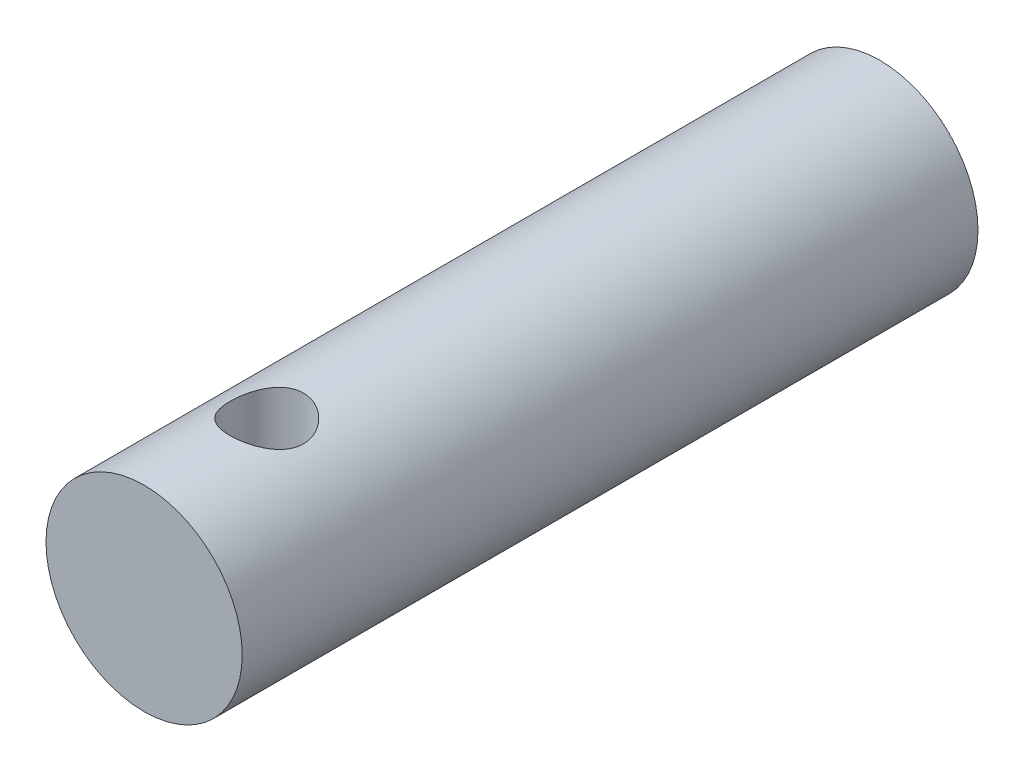
ISO-10303-21;
HEADER;
FILE_DESCRIPTION(('STEP AP214'),'2;1');
FILE_NAME('part.step','',(''),(''),'','','');
FILE_SCHEMA(('AUTOMOTIVE_DESIGN { 1 0 10303 214 1 1 1 1 }'));
ENDSEC;
DATA;
#1=APPLICATION_CONTEXT('core data for automotive mechanical design processes');
#2=APPLICATION_PROTOCOL_DEFINITION('international standard','automotive_design',2000,#1);
#3=PRODUCT_CONTEXT('',#1,'mechanical');
#4=PRODUCT('Part','Part','',(#3));
#5=PRODUCT_RELATED_PRODUCT_CATEGORY('part','',(#4));
#6=PRODUCT_DEFINITION_FORMATION('','',#4);
#7=PRODUCT_DEFINITION_CONTEXT('part definition',#1,'design');
#8=PRODUCT_DEFINITION('design','',#6,#7);
#9=PRODUCT_DEFINITION_SHAPE('','',#8);
#10=(LENGTH_UNIT() NAMED_UNIT(*) SI_UNIT(.MILLI.,.METRE.));
#11=(NAMED_UNIT(*) PLANE_ANGLE_UNIT() SI_UNIT($,.RADIAN.));
#12=(NAMED_UNIT(*) SI_UNIT($,.STERADIAN.) SOLID_ANGLE_UNIT());
#13=UNCERTAINTY_MEASURE_WITH_UNIT(LENGTH_MEASURE(1.E-05),#10,'distance_accuracy_value','');
#14=(GEOMETRIC_REPRESENTATION_CONTEXT(3) GLOBAL_UNCERTAINTY_ASSIGNED_CONTEXT((#13)) GLOBAL_UNIT_ASSIGNED_CONTEXT((#10,
#11,#12)) REPRESENTATION_CONTEXT('',''));
#15=CARTESIAN_POINT('',(0.,0.,0.));
#16=DIRECTION('',(0.,0.,1.));
#17=DIRECTION('',(1.,0.,0.));
#18=AXIS2_PLACEMENT_3D('',#15,#16,#17);
#19=CARTESIAN_POINT('',(0.,0.,30.));
#20=DIRECTION('',(0.,0.,-1.));
#21=DIRECTION('',(-1.,0.,0.));
#22=AXIS2_PLACEMENT_3D('',#19,#20,#21);
#23=CYLINDRICAL_SURFACE('',#22,4.);
#24=CARTESIAN_POINT('',(0.,-4.,26.5));
#25=CARTESIAN_POINT('',(0.0812350589378528,-4.00000217456151,26.5000029023031));
#26=CARTESIAN_POINT('',(0.162450241781792,-3.99750379283184,26.4933802397516));
#27=CARTESIAN_POINT('',(0.322453452352361,-3.98778696006928,26.4671718047301));
#28=CARTESIAN_POINT('',(0.401241827987616,-3.98056918893993,26.4475878995294));
#29=CARTESIAN_POINT('',(0.554060784990878,-3.96218832391545,26.3962469982282));
#30=CARTESIAN_POINT('',(0.628100224162277,-3.9510328434944,26.3645134831782));
#31=CARTESIAN_POINT('',(0.769799310160253,-3.92588767765353,26.2898935869842));
#32=CARTESIAN_POINT('',(0.837457239177879,-3.91189723227548,26.2470042144558));
#33=CARTESIAN_POINT('',(0.967346417045826,-3.88186246971217,26.1493874689291));
#34=CARTESIAN_POINT('',(1.02927073015119,-3.86576002583566,26.0942697377406));
#35=CARTESIAN_POINT('',(1.14324421474363,-3.83360220871327,25.9745895653412));
#36=CARTESIAN_POINT('',(1.19529036359203,-3.81754685135033,25.9100242439121));
#37=CARTESIAN_POINT('',(1.28998202215985,-3.78662470617731,25.7702825324768));
#38=CARTESIAN_POINT('',(1.3321939319576,-3.77182648820818,25.6947956334542));
#39=CARTESIAN_POINT('',(1.40318646334084,-3.74599860237433,25.5371516458315));
#40=CARTESIAN_POINT('',(1.43197244961239,-3.73496742975881,25.4549972368449));
#41=CARTESIAN_POINT('',(1.47408431017549,-3.71854412824136,25.2898832597418));
#42=CARTESIAN_POINT('',(1.48799593218558,-3.71293924350838,25.2070949615646));
#43=CARTESIAN_POINT('',(1.50179556531648,-3.70738061461215,25.0401838420062));
#44=CARTESIAN_POINT('',(1.50168936802631,-3.70742453659305,24.9560615861255));
#45=CARTESIAN_POINT('',(1.48790429610018,-3.71297511632055,24.794230474787));
#46=CARTESIAN_POINT('',(1.47503808509003,-3.71815468871121,24.7164390939558));
#47=CARTESIAN_POINT('',(1.4374416786833,-3.73284938059529,24.5642128495947));
#48=CARTESIAN_POINT('',(1.41270969663258,-3.74236515298863,24.4897784933861));
#49=CARTESIAN_POINT('',(1.35163748571904,-3.76485702190253,24.3447229322718));
#50=CARTESIAN_POINT('',(1.31508648737101,-3.77789517988166,24.2742005138787));
#51=CARTESIAN_POINT('',(1.23156073762698,-3.80594210139319,24.140054262409));
#52=CARTESIAN_POINT('',(1.18458238728897,-3.82095154457158,24.0764328224803));
#53=CARTESIAN_POINT('',(1.07781780766549,-3.85248038859113,23.9533963363491));
#54=CARTESIAN_POINT('',(1.01738298716956,-3.86903347455671,23.8945513592519));
#55=CARTESIAN_POINT('',(0.887312590819022,-3.90091728164085,23.7876620337942));
#56=CARTESIAN_POINT('',(0.817675603497365,-3.91624781465952,23.7396193453943));
#57=CARTESIAN_POINT('',(0.66972343699242,-3.9442639480908,23.6550696029375));
#58=CARTESIAN_POINT('',(0.59129071384472,-3.95690498259616,23.6187524187789));
#59=CARTESIAN_POINT('',(0.428836850524583,-3.97778718326962,23.56001739573));
#60=CARTESIAN_POINT('',(0.344818210845767,-3.98603030341493,23.5375933834389));
#61=CARTESIAN_POINT('',(0.178375243148665,-3.99684443228065,23.5083772124581));
#62=CARTESIAN_POINT('',(0.0961036195622089,-3.99969369025686,23.5008173936175));
#63=CARTESIAN_POINT('',(-0.0685724752550242,-4.00025893700126,23.4993089361001));
#64=CARTESIAN_POINT('',(-0.150976912983372,-3.99797606386863,23.5053572796832));
#65=CARTESIAN_POINT('',(-0.310262048561859,-3.98871709772643,23.5303100423087));
#66=CARTESIAN_POINT('',(-0.387233328007335,-3.98192470962305,23.5487115437371));
#67=CARTESIAN_POINT('',(-0.53694175495722,-3.96451477091717,23.5971860725473));
#68=CARTESIAN_POINT('',(-0.609678350347534,-3.9538967228203,23.627260617948));
#69=CARTESIAN_POINT('',(-0.751247765110155,-3.92949624407681,23.6991864124395));
#70=CARTESIAN_POINT('',(-0.819903083557795,-3.91563000209348,23.7413577292234));
#71=CARTESIAN_POINT('',(-0.949392711726626,-3.88626671564664,23.8359181031716));
#72=CARTESIAN_POINT('',(-1.01022412027045,-3.87076907009516,23.8883109325452));
#73=CARTESIAN_POINT('',(-1.12603079874454,-3.8387332949099,24.0054041221243));
#74=CARTESIAN_POINT('',(-1.18046154123568,-3.82218696503729,24.0706421827727));
#75=CARTESIAN_POINT('',(-1.27771050031903,-3.79078815746854,24.2096513847077));
#76=CARTESIAN_POINT('',(-1.32052767414518,-3.77593583194399,24.2834232913885));
#77=CARTESIAN_POINT('',(-1.39337773518998,-3.74966829822463,24.4380159867723));
#78=CARTESIAN_POINT('',(-1.42335685446918,-3.73826760328493,24.5188647459104));
#79=CARTESIAN_POINT('',(-1.46907883466889,-3.72054032891005,24.6850097636878));
#80=CARTESIAN_POINT('',(-1.48483050305535,-3.71421061057491,24.7703032361981));
#81=CARTESIAN_POINT('',(-1.50086347097839,-3.70775894792573,24.9370161595411));
#82=CARTESIAN_POINT('',(-1.50207331495837,-3.70726444523341,25.0183326317169));
#83=CARTESIAN_POINT('',(-1.49136715641593,-3.71158412745292,25.1799453162762));
#84=CARTESIAN_POINT('',(-1.47945239850124,-3.71639780898899,25.2602416246716));
#85=CARTESIAN_POINT('',(-1.44355815630242,-3.73048141585432,25.4150472267165));
#86=CARTESIAN_POINT('',(-1.41995798316524,-3.73961085376663,25.4896583462453));
#87=CARTESIAN_POINT('',(-1.3616969677992,-3.76121548297845,25.6339055084944));
#88=CARTESIAN_POINT('',(-1.32703332944945,-3.77369151995215,25.7035402880701));
#89=CARTESIAN_POINT('',(-1.24552075938154,-3.80139723903964,25.8398267896976));
#90=CARTESIAN_POINT('',(-1.1981283280301,-3.81673698440964,25.9061307967999));
#91=CARTESIAN_POINT('',(-1.09334485729906,-3.84806246757177,26.0301415609712));
#92=CARTESIAN_POINT('',(-1.03595064012808,-3.86404840943145,26.0878455747868));
#93=CARTESIAN_POINT('',(-0.909080396784623,-3.89590424609881,26.1962019558218));
#94=CARTESIAN_POINT('',(-0.839118644212992,-3.91172104900645,26.2463037534347));
#95=CARTESIAN_POINT('',(-0.691213223200821,-3.94054514457031,26.3340226552766));
#96=CARTESIAN_POINT('',(-0.613268934090622,-3.95355221851559,26.3716387877364));
#97=CARTESIAN_POINT('',(-0.447999082002314,-3.9757429260668,26.4343768290483));
#98=CARTESIAN_POINT('',(-0.360413422234211,-3.98473657158356,26.4588870646019));
#99=CARTESIAN_POINT('',(-0.181875733606384,-3.99686242179587,26.4916929599207));
#100=CARTESIAN_POINT('',(-0.0909254163648598,-3.99999756603967,26.4999967514873));
#101=CARTESIAN_POINT('',(0.,-4.,26.5));
#102=B_SPLINE_CURVE_WITH_KNOTS('',3,(#24,#25,#26,#27,#28,#29,#30,#31,#32,#33,#34,#35,#36,#37,
#38,#39,#40,#41,#42,#43,#44,#45,#46,#47,#48,#49,#50,#51,#52,#53,#54,#55,#56,#57,#58,#59,#60,#61,
#62,#63,#64,#65,#66,#67,#68,#69,#70,#71,#72,#73,#74,#75,#76,#77,#78,#79,#80,#81,#82,#83,#84,#85,
#86,#87,#88,#89,#90,#91,#92,#93,#94,#95,#96,#97,#98,#99,#100,#101),.UNSPECIFIED.,.T.,.F.,(4,2,2,
2,2,2,2,2,2,2,2,2,2,2,2,2,2,2,2,2,2,2,2,2,2,2,2,2,2,2,2,2,2,2,2,2,2,2,4),(0.,0.24336980156056,
0.48670454953046,0.729571369213572,0.972503379609489,1.22473618582715,1.47704604925622,
1.73896674501658,2.00078269352134,2.25185874416901,2.50283106079707,2.73878345119972,
2.97477138060589,3.21522408387018,3.45575990744259,3.71246153335813,3.96920257905066,
4.22991375286075,4.49050899698846,4.73725019635926,4.98393668390521,5.2211443792384,
5.45838293254454,5.702592218596,5.94689180019868,6.20536519455658,6.46386178920141,
6.72343066727205,6.98283874956507,7.22558763480252,7.46831350211259,7.70363142426534,
7.93900886656507,8.18672471884272,8.43451941997063,8.6957232965404,8.95694749805102,
9.22948515032042,9.50188601796128),.UNSPECIFIED.);
#103=CARTESIAN_POINT('',(0.,-4.,26.5));
#104=VERTEX_POINT('',#103);
#105=EDGE_CURVE('E10',#104,#104,#102,.T.);
#106=ORIENTED_EDGE('',*,*,#105,.T.);
#107=EDGE_LOOP('',(#106));
#108=FACE_BOUND('',#107,.T.);
#109=CARTESIAN_POINT('',(0.,4.,26.5));
#110=CARTESIAN_POINT('',(-0.0812350589378528,4.00000217456151,26.5000029023031));
#111=CARTESIAN_POINT('',(-0.162450241781792,3.99750379283184,26.4933802397516));
#112=CARTESIAN_POINT('',(-0.322453452352361,3.98778696006928,26.4671718047301));
#113=CARTESIAN_POINT('',(-0.401241827987616,3.98056918893993,26.4475878995294));
#114=CARTESIAN_POINT('',(-0.554060784990878,3.96218832391545,26.3962469982282));
#115=CARTESIAN_POINT('',(-0.628100224162277,3.9510328434944,26.3645134831782));
#116=CARTESIAN_POINT('',(-0.769799310160253,3.92588767765353,26.2898935869842));
#117=CARTESIAN_POINT('',(-0.837457239177879,3.91189723227548,26.2470042144558));
#118=CARTESIAN_POINT('',(-0.967346417045826,3.88186246971217,26.1493874689291));
#119=CARTESIAN_POINT('',(-1.02927073015119,3.86576002583566,26.0942697377406));
#120=CARTESIAN_POINT('',(-1.14324421474363,3.83360220871327,25.9745895653412));
#121=CARTESIAN_POINT('',(-1.19529036359203,3.81754685135033,25.9100242439121));
#122=CARTESIAN_POINT('',(-1.28998202215985,3.78662470617731,25.7702825324768));
#123=CARTESIAN_POINT('',(-1.3321939319576,3.77182648820818,25.6947956334542));
#124=CARTESIAN_POINT('',(-1.40318646334084,3.74599860237433,25.5371516458315));
#125=CARTESIAN_POINT('',(-1.43197244961239,3.73496742975881,25.4549972368449));
#126=CARTESIAN_POINT('',(-1.47408431017549,3.71854412824136,25.2898832597418));
#127=CARTESIAN_POINT('',(-1.48799593218558,3.71293924350838,25.2070949615646));
#128=CARTESIAN_POINT('',(-1.50179556531648,3.70738061461215,25.0401838420062));
#129=CARTESIAN_POINT('',(-1.50168936802631,3.70742453659305,24.9560615861255));
#130=CARTESIAN_POINT('',(-1.48790429610018,3.71297511632055,24.794230474787));
#131=CARTESIAN_POINT('',(-1.47503808509003,3.71815468871121,24.7164390939558));
#132=CARTESIAN_POINT('',(-1.4374416786833,3.73284938059529,24.5642128495947));
#133=CARTESIAN_POINT('',(-1.41270969663258,3.74236515298863,24.4897784933861));
#134=CARTESIAN_POINT('',(-1.35163748571904,3.76485702190253,24.3447229322718));
#135=CARTESIAN_POINT('',(-1.31508648737101,3.77789517988166,24.2742005138787));
#136=CARTESIAN_POINT('',(-1.23156073762698,3.80594210139319,24.140054262409));
#137=CARTESIAN_POINT('',(-1.18458238728897,3.82095154457158,24.0764328224803));
#138=CARTESIAN_POINT('',(-1.07781780766549,3.85248038859113,23.9533963363491));
#139=CARTESIAN_POINT('',(-1.01738298716956,3.86903347455671,23.8945513592519));
#140=CARTESIAN_POINT('',(-0.887312590819022,3.90091728164085,23.7876620337942));
#141=CARTESIAN_POINT('',(-0.817675603497365,3.91624781465952,23.7396193453943));
#142=CARTESIAN_POINT('',(-0.66972343699242,3.9442639480908,23.6550696029375));
#143=CARTESIAN_POINT('',(-0.59129071384472,3.95690498259616,23.6187524187789));
#144=CARTESIAN_POINT('',(-0.428836850524583,3.97778718326962,23.56001739573));
#145=CARTESIAN_POINT('',(-0.344818210845767,3.98603030341493,23.5375933834389));
#146=CARTESIAN_POINT('',(-0.178375243148665,3.99684443228065,23.5083772124581));
#147=CARTESIAN_POINT('',(-0.0961036195622089,3.99969369025686,23.5008173936175));
#148=CARTESIAN_POINT('',(0.0685724752550242,4.00025893700126,23.4993089361001));
#149=CARTESIAN_POINT('',(0.150976912983372,3.99797606386863,23.5053572796832));
#150=CARTESIAN_POINT('',(0.310262048561859,3.98871709772643,23.5303100423087));
#151=CARTESIAN_POINT('',(0.387233328007335,3.98192470962305,23.5487115437371));
#152=CARTESIAN_POINT('',(0.53694175495722,3.96451477091717,23.5971860725473));
#153=CARTESIAN_POINT('',(0.609678350347534,3.9538967228203,23.627260617948));
#154=CARTESIAN_POINT('',(0.751247765110155,3.92949624407681,23.6991864124395));
#155=CARTESIAN_POINT('',(0.819903083557795,3.91563000209348,23.7413577292234));
#156=CARTESIAN_POINT('',(0.949392711726626,3.88626671564664,23.8359181031716));
#157=CARTESIAN_POINT('',(1.01022412027045,3.87076907009516,23.8883109325452));
#158=CARTESIAN_POINT('',(1.12603079874454,3.8387332949099,24.0054041221243));
#159=CARTESIAN_POINT('',(1.18046154123568,3.82218696503729,24.0706421827727));
#160=CARTESIAN_POINT('',(1.27771050031903,3.79078815746854,24.2096513847077));
#161=CARTESIAN_POINT('',(1.32052767414518,3.77593583194399,24.2834232913885));
#162=CARTESIAN_POINT('',(1.39337773518998,3.74966829822463,24.4380159867723));
#163=CARTESIAN_POINT('',(1.42335685446918,3.73826760328493,24.5188647459104));
#164=CARTESIAN_POINT('',(1.46907883466889,3.72054032891005,24.6850097636878));
#165=CARTESIAN_POINT('',(1.48483050305535,3.71421061057491,24.7703032361981));
#166=CARTESIAN_POINT('',(1.50086347097839,3.70775894792573,24.9370161595411));
#167=CARTESIAN_POINT('',(1.50207331495837,3.70726444523341,25.0183326317169));
#168=CARTESIAN_POINT('',(1.49136715641593,3.71158412745292,25.1799453162762));
#169=CARTESIAN_POINT('',(1.47945239850124,3.71639780898899,25.2602416246716));
#170=CARTESIAN_POINT('',(1.44355815630242,3.73048141585432,25.4150472267165));
#171=CARTESIAN_POINT('',(1.41995798316524,3.73961085376663,25.4896583462453));
#172=CARTESIAN_POINT('',(1.3616969677992,3.76121548297845,25.6339055084944));
#173=CARTESIAN_POINT('',(1.32703332944945,3.77369151995215,25.7035402880701));
#174=CARTESIAN_POINT('',(1.24552075938154,3.80139723903964,25.8398267896976));
#175=CARTESIAN_POINT('',(1.1981283280301,3.81673698440964,25.9061307967999));
#176=CARTESIAN_POINT('',(1.09334485729906,3.84806246757177,26.0301415609712));
#177=CARTESIAN_POINT('',(1.03595064012808,3.86404840943145,26.0878455747868));
#178=CARTESIAN_POINT('',(0.909080396784623,3.89590424609881,26.1962019558218));
#179=CARTESIAN_POINT('',(0.839118644212992,3.91172104900645,26.2463037534347));
#180=CARTESIAN_POINT('',(0.691213223200821,3.94054514457031,26.3340226552766));
#181=CARTESIAN_POINT('',(0.613268934090622,3.95355221851559,26.3716387877364));
#182=CARTESIAN_POINT('',(0.447999082002314,3.9757429260668,26.4343768290483));
#183=CARTESIAN_POINT('',(0.360413422234211,3.98473657158356,26.4588870646019));
#184=CARTESIAN_POINT('',(0.181875733606384,3.99686242179587,26.4916929599207));
#185=CARTESIAN_POINT('',(0.0909254163648598,3.99999756603967,26.4999967514873));
#186=CARTESIAN_POINT('',(0.,4.,26.5));
#187=B_SPLINE_CURVE_WITH_KNOTS('',3,(#109,#110,#111,#112,#113,#114,#115,#116,#117,#118,#119,
#120,#121,#122,#123,#124,#125,#126,#127,#128,#129,#130,#131,#132,#133,#134,#135,#136,#137,#138,
#139,#140,#141,#142,#143,#144,#145,#146,#147,#148,#149,#150,#151,#152,#153,#154,#155,#156,#157,
#158,#159,#160,#161,#162,#163,#164,#165,#166,#167,#168,#169,#170,#171,#172,#173,#174,#175,#176,
#177,#178,#179,#180,#181,#182,#183,#184,#185,#186),.UNSPECIFIED.,.T.,.F.,(4,2,2,2,2,2,2,2,2,2,2,
2,2,2,2,2,2,2,2,2,2,2,2,2,2,2,2,2,2,2,2,2,2,2,2,2,2,2,4),(0.,0.24336980156056,0.48670454953046,
0.729571369213572,0.972503379609489,1.22473618582715,1.47704604925622,1.73896674501658,
2.00078269352134,2.25185874416901,2.50283106079707,2.73878345119972,2.97477138060589,
3.21522408387018,3.45575990744259,3.71246153335813,3.96920257905066,4.22991375286075,
4.49050899698846,4.73725019635926,4.98393668390521,5.2211443792384,5.45838293254454,
5.702592218596,5.94689180019868,6.20536519455658,6.46386178920141,6.72343066727205,
6.98283874956507,7.22558763480252,7.46831350211259,7.70363142426534,7.93900886656507,
8.18672471884272,8.43451941997063,8.6957232965404,8.95694749805102,9.22948515032042,
9.50188601796128),.UNSPECIFIED.);
#188=CARTESIAN_POINT('',(0.,4.,26.5));
#189=VERTEX_POINT('',#188);
#190=EDGE_CURVE('E48',#189,#189,#187,.T.);
#191=ORIENTED_EDGE('',*,*,#190,.T.);
#192=EDGE_LOOP('',(#191));
#193=FACE_BOUND('',#192,.T.);
#194=CARTESIAN_POINT('',(0.,0.,30.));
#195=DIRECTION('',(0.,0.,1.));
#196=DIRECTION('',(1.,0.,0.));
#197=AXIS2_PLACEMENT_3D('',#194,#195,#196);
#198=CIRCLE('',#197,4.);
#199=CARTESIAN_POINT('',(4.,0.,30.));
#200=VERTEX_POINT('',#199);
#201=EDGE_CURVE('E52',#200,#200,#198,.T.);
#202=ORIENTED_EDGE('',*,*,#201,.F.);
#203=EDGE_LOOP('',(#202));
#204=FACE_BOUND('',#203,.T.);
#205=CARTESIAN_POINT('',(0.,0.,0.));
#206=DIRECTION('',(0.,0.,1.));
#207=DIRECTION('',(1.,0.,0.));
#208=AXIS2_PLACEMENT_3D('',#205,#206,#207);
#209=CIRCLE('',#208,4.);
#210=CARTESIAN_POINT('',(4.,0.,0.));
#211=VERTEX_POINT('',#210);
#212=EDGE_CURVE('E56',#211,#211,#209,.T.);
#213=ORIENTED_EDGE('',*,*,#212,.T.);
#214=EDGE_LOOP('',(#213));
#215=FACE_BOUND('',#214,.T.);
#216=ADVANCED_FACE('F37',(#108,#193,#204,#215),#23,.T.);
#217=CARTESIAN_POINT('',(0.,0.,30.));
#218=DIRECTION('',(0.,0.,1.));
#219=DIRECTION('',(1.,0.,0.));
#220=AXIS2_PLACEMENT_3D('',#217,#218,#219);
#221=PLANE('',#220);
#222=ORIENTED_EDGE('',*,*,#201,.T.);
#223=EDGE_LOOP('',(#222));
#224=FACE_BOUND('',#223,.T.);
#225=ADVANCED_FACE('F68',(#224),#221,.T.);
#226=CARTESIAN_POINT('',(0.,0.,0.));
#227=DIRECTION('',(0.,0.,1.));
#228=DIRECTION('',(1.,0.,0.));
#229=AXIS2_PLACEMENT_3D('',#226,#227,#228);
#230=PLANE('',#229);
#231=ORIENTED_EDGE('',*,*,#212,.F.);
#232=EDGE_LOOP('',(#231));
#233=FACE_BOUND('',#232,.T.);
#234=ADVANCED_FACE('F66',(#233),#230,.F.);
#235=CARTESIAN_POINT('',(0.,-4.,25.));
#236=DIRECTION('',(0.,1.,0.));
#237=DIRECTION('',(0.,0.,1.));
#238=AXIS2_PLACEMENT_3D('',#235,#236,#237);
#239=CYLINDRICAL_SURFACE('',#238,1.5);
#240=ORIENTED_EDGE('',*,*,#190,.F.);
#241=EDGE_LOOP('',(#240));
#242=FACE_BOUND('',#241,.T.);
#243=ORIENTED_EDGE('',*,*,#105,.F.);
#244=EDGE_LOOP('',(#243));
#245=FACE_BOUND('',#244,.T.);
#246=ADVANCED_FACE('F62',(#242,#245),#239,.F.);
#247=CLOSED_SHELL('',(#216,#225,#234,#246));
#248=MANIFOLD_SOLID_BREP('B2',#247);
#249=ADVANCED_BREP_SHAPE_REPRESENTATION('',(#18,#248),#14);
#250=SHAPE_DEFINITION_REPRESENTATION(#9,#249);
ENDSEC;
END-ISO-10303-21;
